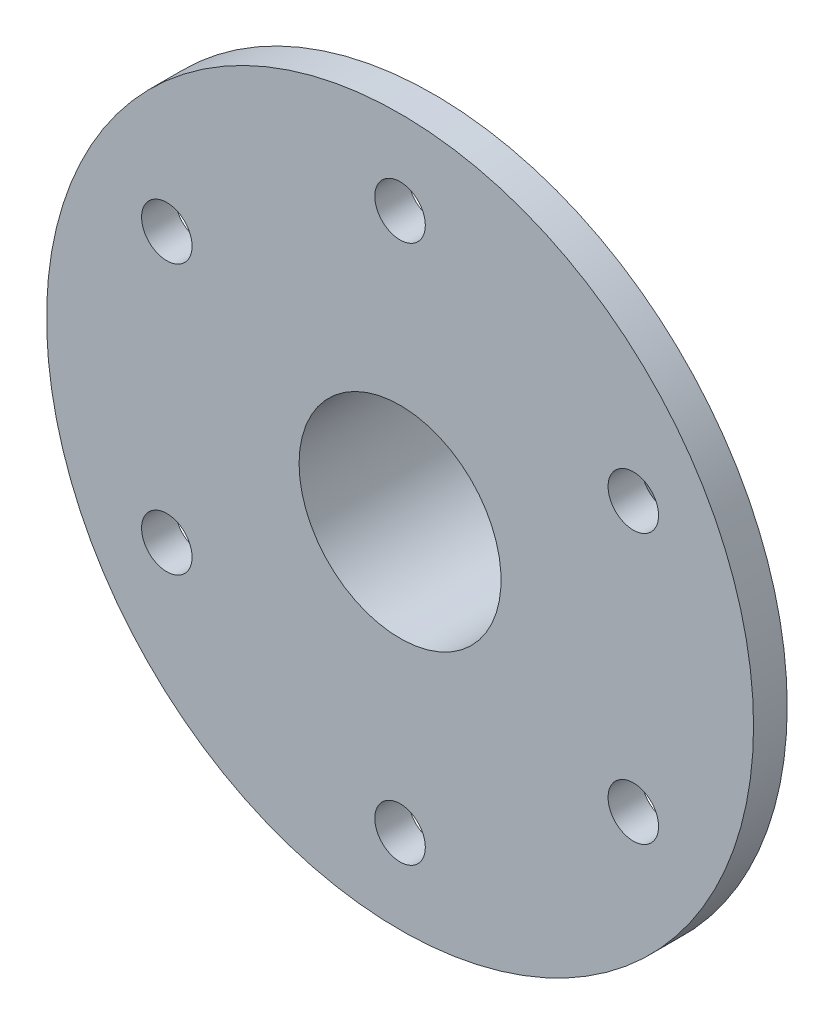
ISO-10303-21;
HEADER;
FILE_DESCRIPTION(('STEP AP214'),'2;1');
FILE_NAME('part.step','',(''),(''),'','','');
FILE_SCHEMA(('AUTOMOTIVE_DESIGN { 1 0 10303 214 1 1 1 1 }'));
ENDSEC;
DATA;
#1=APPLICATION_CONTEXT('core data for automotive mechanical design processes');
#2=APPLICATION_PROTOCOL_DEFINITION('international standard','automotive_design',2000,#1);
#3=PRODUCT_CONTEXT('',#1,'mechanical');
#4=PRODUCT('Part','Part','',(#3));
#5=PRODUCT_RELATED_PRODUCT_CATEGORY('part','',(#4));
#6=PRODUCT_DEFINITION_FORMATION('','',#4);
#7=PRODUCT_DEFINITION_CONTEXT('part definition',#1,'design');
#8=PRODUCT_DEFINITION('design','',#6,#7);
#9=PRODUCT_DEFINITION_SHAPE('','',#8);
#10=(LENGTH_UNIT() NAMED_UNIT(*) SI_UNIT(.MILLI.,.METRE.));
#11=(NAMED_UNIT(*) PLANE_ANGLE_UNIT() SI_UNIT($,.RADIAN.));
#12=(NAMED_UNIT(*) SI_UNIT($,.STERADIAN.) SOLID_ANGLE_UNIT());
#13=UNCERTAINTY_MEASURE_WITH_UNIT(LENGTH_MEASURE(1.E-05),#10,'distance_accuracy_value','');
#14=(GEOMETRIC_REPRESENTATION_CONTEXT(3) GLOBAL_UNCERTAINTY_ASSIGNED_CONTEXT((#13)) GLOBAL_UNIT_ASSIGNED_CONTEXT((#10,
#11,#12)) REPRESENTATION_CONTEXT('',''));
#15=CARTESIAN_POINT('',(0.,0.,0.));
#16=DIRECTION('',(0.,0.,1.));
#17=DIRECTION('',(1.,0.,0.));
#18=AXIS2_PLACEMENT_3D('',#15,#16,#17);
#19=CARTESIAN_POINT('',(0.,0.,4.));
#20=DIRECTION('',(0.,0.,-1.));
#21=DIRECTION('',(-1.,0.,0.));
#22=AXIS2_PLACEMENT_3D('',#19,#20,#21);
#23=CYLINDRICAL_SURFACE('',#22,9.985);
#24=CARTESIAN_POINT('',(0.,0.,4.));
#25=DIRECTION('',(0.,0.,1.));
#26=DIRECTION('',(1.,0.,0.));
#27=AXIS2_PLACEMENT_3D('',#24,#25,#26);
#28=CIRCLE('',#27,9.985);
#29=CARTESIAN_POINT('',(9.985,0.,4.));
#30=VERTEX_POINT('',#29);
#31=EDGE_CURVE('E54',#30,#30,#28,.T.);
#32=ORIENTED_EDGE('',*,*,#31,.F.);
#33=EDGE_LOOP('',(#32));
#34=FACE_BOUND('',#33,.T.);
#35=CARTESIAN_POINT('',(0.,0.,0.));
#36=DIRECTION('',(0.,0.,1.));
#37=DIRECTION('',(1.,0.,0.));
#38=AXIS2_PLACEMENT_3D('',#35,#36,#37);
#39=CIRCLE('',#38,9.985);
#40=CARTESIAN_POINT('',(9.985,0.,0.));
#41=VERTEX_POINT('',#40);
#42=EDGE_CURVE('E59',#41,#41,#39,.T.);
#43=ORIENTED_EDGE('',*,*,#42,.T.);
#44=EDGE_LOOP('',(#43));
#45=FACE_BOUND('',#44,.T.);
#46=ADVANCED_FACE('F41',(#34,#45),#23,.T.);
#47=CARTESIAN_POINT('',(0.,0.,0.));
#48=DIRECTION('',(0.,0.,1.));
#49=DIRECTION('',(1.,0.,0.));
#50=AXIS2_PLACEMENT_3D('',#47,#48,#49);
#51=PLANE('',#50);
#52=CARTESIAN_POINT('',(0.,0.,0.));
#53=DIRECTION('',(0.,0.,-1.));
#54=DIRECTION('',(-1.,0.,0.));
#55=AXIS2_PLACEMENT_3D('',#52,#53,#54);
#56=CIRCLE('',#55,6.);
#57=CARTESIAN_POINT('',(-6.,0.,0.));
#58=VERTEX_POINT('',#57);
#59=EDGE_CURVE('E126',#58,#58,#56,.T.);
#60=ORIENTED_EDGE('',*,*,#59,.F.);
#61=EDGE_LOOP('',(#60));
#62=FACE_BOUND('',#61,.T.);
#63=ORIENTED_EDGE('',*,*,#42,.F.);
#64=EDGE_LOOP('',(#63));
#65=FACE_BOUND('',#64,.T.);
#66=ADVANCED_FACE('F144',(#62,#65),#51,.F.);
#67=CARTESIAN_POINT('',(0.,0.,7.));
#68=DIRECTION('',(0.,0.,-1.));
#69=DIRECTION('',(-1.,0.,0.));
#70=AXIS2_PLACEMENT_3D('',#67,#68,#69);
#71=CYLINDRICAL_SURFACE('',#70,11.5);
#72=CARTESIAN_POINT('',(0.,0.,5.5));
#73=DIRECTION('',(0.,0.,1.));
#74=DIRECTION('',(1.,0.,0.));
#75=AXIS2_PLACEMENT_3D('',#72,#73,#74);
#76=CIRCLE('',#75,11.5);
#77=CARTESIAN_POINT('',(11.5,0.,5.5));
#78=VERTEX_POINT('',#77);
#79=EDGE_CURVE('E10',#78,#78,#76,.F.);
#80=ORIENTED_EDGE('',*,*,#79,.T.);
#81=EDGE_LOOP('',(#80));
#82=FACE_BOUND('',#81,.T.);
#83=CARTESIAN_POINT('',(0.,0.,4.));
#84=DIRECTION('',(0.,0.,1.));
#85=DIRECTION('',(1.,0.,0.));
#86=AXIS2_PLACEMENT_3D('',#83,#84,#85);
#87=CIRCLE('',#86,11.5);
#88=CARTESIAN_POINT('',(11.5,0.,4.));
#89=VERTEX_POINT('',#88);
#90=EDGE_CURVE('E64',#89,#89,#87,.T.);
#91=ORIENTED_EDGE('',*,*,#90,.T.);
#92=EDGE_LOOP('',(#91));
#93=FACE_BOUND('',#92,.T.);
#94=ADVANCED_FACE('F147',(#82,#93),#71,.T.);
#95=CARTESIAN_POINT('',(0.,0.,4.));
#96=DIRECTION('',(0.,0.,1.));
#97=DIRECTION('',(1.,0.,0.));
#98=AXIS2_PLACEMENT_3D('',#95,#96,#97);
#99=PLANE('',#98);
#100=ORIENTED_EDGE('',*,*,#31,.T.);
#101=EDGE_LOOP('',(#100));
#102=FACE_BOUND('',#101,.T.);
#103=ORIENTED_EDGE('',*,*,#90,.F.);
#104=EDGE_LOOP('',(#103));
#105=FACE_BOUND('',#104,.T.);
#106=ADVANCED_FACE('F159',(#102,#105),#99,.F.);
#107=CARTESIAN_POINT('',(0.,0.,9.));
#108=DIRECTION('',(0.,0.,1.));
#109=DIRECTION('',(1.,0.,0.));
#110=AXIS2_PLACEMENT_3D('',#107,#108,#109);
#111=PLANE('',#110);
#112=CARTESIAN_POINT('',(0.,0.,9.));
#113=DIRECTION('',(0.,0.,-1.));
#114=DIRECTION('',(-1.,0.,0.));
#115=AXIS2_PLACEMENT_3D('',#112,#113,#114);
#116=CIRCLE('',#115,6.);
#117=CARTESIAN_POINT('',(-6.,0.,9.));
#118=VERTEX_POINT('',#117);
#119=EDGE_CURVE('E122',#118,#118,#116,.T.);
#120=ORIENTED_EDGE('',*,*,#119,.T.);
#121=EDGE_LOOP('',(#120));
#122=FACE_BOUND('',#121,.T.);
#123=CARTESIAN_POINT('',(-13.856406460551,-8.00000000000001,9.));
#124=DIRECTION('',(0.,0.,1.));
#125=DIRECTION('',(1.,0.,0.));
#126=AXIS2_PLACEMENT_3D('',#123,#124,#125);
#127=CIRCLE('',#126,1.5);
#128=CARTESIAN_POINT('',(-12.356406460551,-8.00000000000001,9.));
#129=VERTEX_POINT('',#128);
#130=EDGE_CURVE('E106',#129,#129,#127,.T.);
#131=ORIENTED_EDGE('',*,*,#130,.F.);
#132=EDGE_LOOP('',(#131));
#133=FACE_BOUND('',#132,.T.);
#134=CARTESIAN_POINT('',(13.856406460551,-8.,9.));
#135=DIRECTION('',(0.,0.,1.));
#136=DIRECTION('',(1.,0.,0.));
#137=AXIS2_PLACEMENT_3D('',#134,#135,#136);
#138=CIRCLE('',#137,1.5);
#139=CARTESIAN_POINT('',(15.356406460551,-8.,9.));
#140=VERTEX_POINT('',#139);
#141=EDGE_CURVE('E90',#140,#140,#138,.T.);
#142=ORIENTED_EDGE('',*,*,#141,.F.);
#143=EDGE_LOOP('',(#142));
#144=FACE_BOUND('',#143,.T.);
#145=CARTESIAN_POINT('',(0.,16.,9.));
#146=DIRECTION('',(0.,0.,1.));
#147=DIRECTION('',(1.,0.,0.));
#148=AXIS2_PLACEMENT_3D('',#145,#146,#147);
#149=CIRCLE('',#148,1.5);
#150=CARTESIAN_POINT('',(1.5,16.,9.));
#151=VERTEX_POINT('',#150);
#152=EDGE_CURVE('E74',#151,#151,#149,.T.);
#153=ORIENTED_EDGE('',*,*,#152,.F.);
#154=EDGE_LOOP('',(#153));
#155=FACE_BOUND('',#154,.T.);
#156=CARTESIAN_POINT('',(0.,0.,9.));
#157=DIRECTION('',(0.,0.,1.));
#158=DIRECTION('',(1.,0.,0.));
#159=AXIS2_PLACEMENT_3D('',#156,#157,#158);
#160=CIRCLE('',#159,21.);
#161=CARTESIAN_POINT('',(21.,0.,9.));
#162=VERTEX_POINT('',#161);
#163=EDGE_CURVE('E69',#162,#162,#160,.T.);
#164=ORIENTED_EDGE('',*,*,#163,.T.);
#165=EDGE_LOOP('',(#164));
#166=FACE_BOUND('',#165,.T.);
#167=CARTESIAN_POINT('',(13.856406460551,8.,9.));
#168=DIRECTION('',(0.,0.,1.));
#169=DIRECTION('',(1.,0.,0.));
#170=AXIS2_PLACEMENT_3D('',#167,#168,#169);
#171=CIRCLE('',#170,1.5);
#172=CARTESIAN_POINT('',(15.356406460551,8.,9.));
#173=VERTEX_POINT('',#172);
#174=EDGE_CURVE('E82',#173,#173,#171,.T.);
#175=ORIENTED_EDGE('',*,*,#174,.F.);
#176=EDGE_LOOP('',(#175));
#177=FACE_BOUND('',#176,.T.);
#178=CARTESIAN_POINT('',(0.,-16.,9.));
#179=DIRECTION('',(0.,0.,1.));
#180=DIRECTION('',(1.,0.,0.));
#181=AXIS2_PLACEMENT_3D('',#178,#179,#180);
#182=CIRCLE('',#181,1.5);
#183=CARTESIAN_POINT('',(1.5,-16.,9.));
#184=VERTEX_POINT('',#183);
#185=EDGE_CURVE('E98',#184,#184,#182,.T.);
#186=ORIENTED_EDGE('',*,*,#185,.F.);
#187=EDGE_LOOP('',(#186));
#188=FACE_BOUND('',#187,.T.);
#189=CARTESIAN_POINT('',(-13.856406460551,7.99999999999999,9.));
#190=DIRECTION('',(0.,0.,1.));
#191=DIRECTION('',(1.,0.,0.));
#192=AXIS2_PLACEMENT_3D('',#189,#190,#191);
#193=CIRCLE('',#192,1.5);
#194=CARTESIAN_POINT('',(-12.356406460551,7.99999999999999,9.));
#195=VERTEX_POINT('',#194);
#196=EDGE_CURVE('E114',#195,#195,#193,.T.);
#197=ORIENTED_EDGE('',*,*,#196,.F.);
#198=EDGE_LOOP('',(#197));
#199=FACE_BOUND('',#198,.T.);
#200=ADVANCED_FACE('F134',(#122,#133,#144,#155,#166,#177,#188,#199),#111,.T.);
#201=CARTESIAN_POINT('',(0.,0.,7.));
#202=DIRECTION('',(0.,0.,1.));
#203=DIRECTION('',(1.,0.,0.));
#204=AXIS2_PLACEMENT_3D('',#201,#202,#203);
#205=PLANE('',#204);
#206=CARTESIAN_POINT('',(0.,0.,7.));
#207=DIRECTION('',(0.,0.,1.));
#208=DIRECTION('',(1.,0.,0.));
#209=AXIS2_PLACEMENT_3D('',#206,#207,#208);
#210=CIRCLE('',#209,13.);
#211=CARTESIAN_POINT('',(13.,0.,7.));
#212=VERTEX_POINT('',#211);
#213=EDGE_CURVE('E49',#212,#212,#210,.T.);
#214=ORIENTED_EDGE('',*,*,#213,.T.);
#215=EDGE_LOOP('',(#214));
#216=FACE_BOUND('',#215,.T.);
#217=CARTESIAN_POINT('',(0.,0.,7.));
#218=DIRECTION('',(0.,0.,1.));
#219=DIRECTION('',(1.,0.,0.));
#220=AXIS2_PLACEMENT_3D('',#217,#218,#219);
#221=CIRCLE('',#220,21.);
#222=CARTESIAN_POINT('',(21.,0.,7.));
#223=VERTEX_POINT('',#222);
#224=EDGE_CURVE('E70',#223,#223,#221,.T.);
#225=ORIENTED_EDGE('',*,*,#224,.F.);
#226=EDGE_LOOP('',(#225));
#227=FACE_BOUND('',#226,.T.);
#228=CARTESIAN_POINT('',(0.,16.,7.));
#229=DIRECTION('',(0.,0.,1.));
#230=DIRECTION('',(1.,0.,0.));
#231=AXIS2_PLACEMENT_3D('',#228,#229,#230);
#232=CIRCLE('',#231,1.5);
#233=CARTESIAN_POINT('',(1.5,16.,7.));
#234=VERTEX_POINT('',#233);
#235=EDGE_CURVE('E78',#234,#234,#232,.T.);
#236=ORIENTED_EDGE('',*,*,#235,.T.);
#237=EDGE_LOOP('',(#236));
#238=FACE_BOUND('',#237,.T.);
#239=CARTESIAN_POINT('',(13.856406460551,8.,7.));
#240=DIRECTION('',(0.,0.,1.));
#241=DIRECTION('',(1.,0.,0.));
#242=AXIS2_PLACEMENT_3D('',#239,#240,#241);
#243=CIRCLE('',#242,1.5);
#244=CARTESIAN_POINT('',(15.356406460551,8.,7.));
#245=VERTEX_POINT('',#244);
#246=EDGE_CURVE('E86',#245,#245,#243,.T.);
#247=ORIENTED_EDGE('',*,*,#246,.T.);
#248=EDGE_LOOP('',(#247));
#249=FACE_BOUND('',#248,.T.);
#250=CARTESIAN_POINT('',(13.856406460551,-8.,7.));
#251=DIRECTION('',(0.,0.,1.));
#252=DIRECTION('',(1.,0.,0.));
#253=AXIS2_PLACEMENT_3D('',#250,#251,#252);
#254=CIRCLE('',#253,1.5);
#255=CARTESIAN_POINT('',(15.356406460551,-8.,7.));
#256=VERTEX_POINT('',#255);
#257=EDGE_CURVE('E94',#256,#256,#254,.T.);
#258=ORIENTED_EDGE('',*,*,#257,.T.);
#259=EDGE_LOOP('',(#258));
#260=FACE_BOUND('',#259,.T.);
#261=CARTESIAN_POINT('',(0.,-16.,7.));
#262=DIRECTION('',(0.,0.,1.));
#263=DIRECTION('',(1.,0.,0.));
#264=AXIS2_PLACEMENT_3D('',#261,#262,#263);
#265=CIRCLE('',#264,1.5);
#266=CARTESIAN_POINT('',(1.5,-16.,7.));
#267=VERTEX_POINT('',#266);
#268=EDGE_CURVE('E102',#267,#267,#265,.T.);
#269=ORIENTED_EDGE('',*,*,#268,.T.);
#270=EDGE_LOOP('',(#269));
#271=FACE_BOUND('',#270,.T.);
#272=CARTESIAN_POINT('',(-13.856406460551,-8.00000000000001,7.));
#273=DIRECTION('',(0.,0.,1.));
#274=DIRECTION('',(1.,0.,0.));
#275=AXIS2_PLACEMENT_3D('',#272,#273,#274);
#276=CIRCLE('',#275,1.5);
#277=CARTESIAN_POINT('',(-12.356406460551,-8.00000000000001,7.));
#278=VERTEX_POINT('',#277);
#279=EDGE_CURVE('E110',#278,#278,#276,.T.);
#280=ORIENTED_EDGE('',*,*,#279,.T.);
#281=EDGE_LOOP('',(#280));
#282=FACE_BOUND('',#281,.T.);
#283=CARTESIAN_POINT('',(-13.856406460551,7.99999999999999,7.));
#284=DIRECTION('',(0.,0.,1.));
#285=DIRECTION('',(1.,0.,0.));
#286=AXIS2_PLACEMENT_3D('',#283,#284,#285);
#287=CIRCLE('',#286,1.5);
#288=CARTESIAN_POINT('',(-12.356406460551,7.99999999999999,7.));
#289=VERTEX_POINT('',#288);
#290=EDGE_CURVE('E118',#289,#289,#287,.T.);
#291=ORIENTED_EDGE('',*,*,#290,.T.);
#292=EDGE_LOOP('',(#291));
#293=FACE_BOUND('',#292,.T.);
#294=ADVANCED_FACE('F167',(#216,#227,#238,#249,#260,#271,#282,#293),#205,.F.);
#295=CARTESIAN_POINT('',(0.,0.,9.));
#296=DIRECTION('',(0.,0.,-1.));
#297=DIRECTION('',(-1.,0.,0.));
#298=AXIS2_PLACEMENT_3D('',#295,#296,#297);
#299=CYLINDRICAL_SURFACE('',#298,21.);
#300=ORIENTED_EDGE('',*,*,#163,.F.);
#301=EDGE_LOOP('',(#300));
#302=FACE_BOUND('',#301,.T.);
#303=ORIENTED_EDGE('',*,*,#224,.T.);
#304=EDGE_LOOP('',(#303));
#305=FACE_BOUND('',#304,.T.);
#306=ADVANCED_FACE('F163',(#302,#305),#299,.T.);
#307=CARTESIAN_POINT('',(0.,16.,9.));
#308=DIRECTION('',(0.,0.,-1.));
#309=DIRECTION('',(-1.,0.,0.));
#310=AXIS2_PLACEMENT_3D('',#307,#308,#309);
#311=CYLINDRICAL_SURFACE('',#310,1.5);
#312=ORIENTED_EDGE('',*,*,#152,.T.);
#313=EDGE_LOOP('',(#312));
#314=FACE_BOUND('',#313,.T.);
#315=ORIENTED_EDGE('',*,*,#235,.F.);
#316=EDGE_LOOP('',(#315));
#317=FACE_BOUND('',#316,.T.);
#318=ADVANCED_FACE('F166',(#314,#317),#311,.F.);
#319=CARTESIAN_POINT('',(13.856406460551,8.,9.));
#320=DIRECTION('',(0.,0.,-1.));
#321=DIRECTION('',(-1.,0.,0.));
#322=AXIS2_PLACEMENT_3D('',#319,#320,#321);
#323=CYLINDRICAL_SURFACE('',#322,1.5);
#324=ORIENTED_EDGE('',*,*,#174,.T.);
#325=EDGE_LOOP('',(#324));
#326=FACE_BOUND('',#325,.T.);
#327=ORIENTED_EDGE('',*,*,#246,.F.);
#328=EDGE_LOOP('',(#327));
#329=FACE_BOUND('',#328,.T.);
#330=ADVANCED_FACE('F175',(#326,#329),#323,.F.);
#331=CARTESIAN_POINT('',(13.856406460551,-8.,9.));
#332=DIRECTION('',(0.,0.,-1.));
#333=DIRECTION('',(-1.,0.,0.));
#334=AXIS2_PLACEMENT_3D('',#331,#332,#333);
#335=CYLINDRICAL_SURFACE('',#334,1.5);
#336=ORIENTED_EDGE('',*,*,#141,.T.);
#337=EDGE_LOOP('',(#336));
#338=FACE_BOUND('',#337,.T.);
#339=ORIENTED_EDGE('',*,*,#257,.F.);
#340=EDGE_LOOP('',(#339));
#341=FACE_BOUND('',#340,.T.);
#342=ADVANCED_FACE('F179',(#338,#341),#335,.F.);
#343=CARTESIAN_POINT('',(0.,-16.,9.));
#344=DIRECTION('',(0.,0.,-1.));
#345=DIRECTION('',(-1.,0.,0.));
#346=AXIS2_PLACEMENT_3D('',#343,#344,#345);
#347=CYLINDRICAL_SURFACE('',#346,1.5);
#348=ORIENTED_EDGE('',*,*,#185,.T.);
#349=EDGE_LOOP('',(#348));
#350=FACE_BOUND('',#349,.T.);
#351=ORIENTED_EDGE('',*,*,#268,.F.);
#352=EDGE_LOOP('',(#351));
#353=FACE_BOUND('',#352,.T.);
#354=ADVANCED_FACE('F183',(#350,#353),#347,.F.);
#355=CARTESIAN_POINT('',(-13.856406460551,-8.00000000000001,9.));
#356=DIRECTION('',(0.,0.,-1.));
#357=DIRECTION('',(-1.,0.,0.));
#358=AXIS2_PLACEMENT_3D('',#355,#356,#357);
#359=CYLINDRICAL_SURFACE('',#358,1.5);
#360=ORIENTED_EDGE('',*,*,#130,.T.);
#361=EDGE_LOOP('',(#360));
#362=FACE_BOUND('',#361,.T.);
#363=ORIENTED_EDGE('',*,*,#279,.F.);
#364=EDGE_LOOP('',(#363));
#365=FACE_BOUND('',#364,.T.);
#366=ADVANCED_FACE('F187',(#362,#365),#359,.F.);
#367=CARTESIAN_POINT('',(-13.856406460551,7.99999999999999,9.));
#368=DIRECTION('',(0.,0.,-1.));
#369=DIRECTION('',(-1.,0.,0.));
#370=AXIS2_PLACEMENT_3D('',#367,#368,#369);
#371=CYLINDRICAL_SURFACE('',#370,1.5);
#372=ORIENTED_EDGE('',*,*,#196,.T.);
#373=EDGE_LOOP('',(#372));
#374=FACE_BOUND('',#373,.T.);
#375=ORIENTED_EDGE('',*,*,#290,.F.);
#376=EDGE_LOOP('',(#375));
#377=FACE_BOUND('',#376,.T.);
#378=ADVANCED_FACE('F140',(#374,#377),#371,.F.);
#379=CARTESIAN_POINT('',(0.,0.,9.));
#380=DIRECTION('',(0.,0.,-1.));
#381=DIRECTION('',(-1.,0.,0.));
#382=AXIS2_PLACEMENT_3D('',#379,#380,#381);
#383=CYLINDRICAL_SURFACE('',#382,6.);
#384=ORIENTED_EDGE('',*,*,#119,.F.);
#385=EDGE_LOOP('',(#384));
#386=FACE_BOUND('',#385,.T.);
#387=ORIENTED_EDGE('',*,*,#59,.T.);
#388=EDGE_LOOP('',(#387));
#389=FACE_BOUND('',#388,.T.);
#390=ADVANCED_FACE('F137',(#386,#389),#383,.F.);
#391=CARTESIAN_POINT('',(0.,0.,5.5));
#392=DIRECTION('',(0.,0.,1.));
#393=DIRECTION('',(1.,0.,0.));
#394=AXIS2_PLACEMENT_3D('',#391,#392,#393);
#395=TOROIDAL_SURFACE('',#394,13.,1.5);
#396=ORIENTED_EDGE('',*,*,#79,.F.);
#397=EDGE_LOOP('',(#396));
#398=FACE_BOUND('',#397,.T.);
#399=ORIENTED_EDGE('',*,*,#213,.F.);
#400=EDGE_LOOP('',(#399));
#401=FACE_BOUND('',#400,.T.);
#402=ADVANCED_FACE('F43',(#398,#401),#395,.F.);
#403=CLOSED_SHELL('',(#46,#66,#94,#106,#200,#294,#306,#318,#330,#342,#354,#366,#378,#390,#402));
#404=MANIFOLD_SOLID_BREP('B2',#403);
#405=ADVANCED_BREP_SHAPE_REPRESENTATION('',(#18,#404),#14);
#406=SHAPE_DEFINITION_REPRESENTATION(#9,#405);
ENDSEC;
END-ISO-10303-21;
